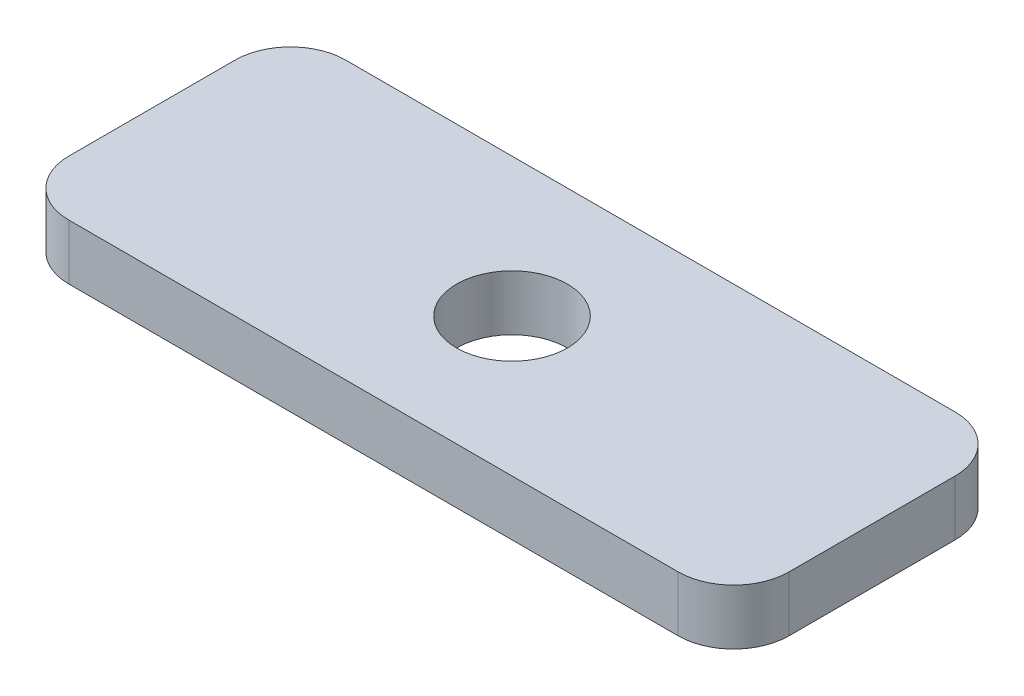
ISO-10303-21;
HEADER;
FILE_DESCRIPTION(('STEP AP214'),'2;1');
FILE_NAME('part.step','',(''),(''),'','','');
FILE_SCHEMA(('AUTOMOTIVE_DESIGN { 1 0 10303 214 1 1 1 1 }'));
ENDSEC;
DATA;
#1=APPLICATION_CONTEXT('core data for automotive mechanical design processes');
#2=APPLICATION_PROTOCOL_DEFINITION('international standard','automotive_design',2000,#1);
#3=PRODUCT_CONTEXT('',#1,'mechanical');
#4=PRODUCT('Part','Part','',(#3));
#5=PRODUCT_RELATED_PRODUCT_CATEGORY('part','',(#4));
#6=PRODUCT_DEFINITION_FORMATION('','',#4);
#7=PRODUCT_DEFINITION_CONTEXT('part definition',#1,'design');
#8=PRODUCT_DEFINITION('design','',#6,#7);
#9=PRODUCT_DEFINITION_SHAPE('','',#8);
#10=(LENGTH_UNIT() NAMED_UNIT(*) SI_UNIT(.MILLI.,.METRE.));
#11=(NAMED_UNIT(*) PLANE_ANGLE_UNIT() SI_UNIT($,.RADIAN.));
#12=(NAMED_UNIT(*) SI_UNIT($,.STERADIAN.) SOLID_ANGLE_UNIT());
#13=UNCERTAINTY_MEASURE_WITH_UNIT(LENGTH_MEASURE(1.E-05),#10,'distance_accuracy_value','');
#14=(GEOMETRIC_REPRESENTATION_CONTEXT(3) GLOBAL_UNCERTAINTY_ASSIGNED_CONTEXT((#13)) GLOBAL_UNIT_ASSIGNED_CONTEXT((#10,
#11,#12)) REPRESENTATION_CONTEXT('',''));
#15=CARTESIAN_POINT('',(0.,0.,0.));
#16=DIRECTION('',(0.,0.,1.));
#17=DIRECTION('',(1.,0.,0.));
#18=AXIS2_PLACEMENT_3D('',#15,#16,#17);
#19=CARTESIAN_POINT('',(0.,2.,-10.));
#20=DIRECTION('',(0.,-1.,0.));
#21=DIRECTION('',(0.,0.,-1.));
#22=AXIS2_PLACEMENT_3D('',#19,#20,#21);
#23=PLANE('',#22);
#24=DIRECTION('',(-1.,0.,0.));
#25=VECTOR('',#24,1.);
#26=CARTESIAN_POINT('',(0.,2.,-10.));
#27=LINE('',#26,#25);
#28=CARTESIAN_POINT('',(24.,2.,-10.));
#29=VERTEX_POINT('',#28);
#30=CARTESIAN_POINT('',(2.,2.,-10.));
#31=VERTEX_POINT('',#30);
#32=EDGE_CURVE('E137',#29,#31,#27,.T.);
#33=ORIENTED_EDGE('',*,*,#32,.T.);
#34=CARTESIAN_POINT('',(2.,2.,-8.));
#35=DIRECTION('',(0.,-1.,0.));
#36=DIRECTION('',(0.,0.,-1.));
#37=AXIS2_PLACEMENT_3D('',#34,#35,#36);
#38=CIRCLE('',#37,2.);
#39=CARTESIAN_POINT('',(0.,2.,-8.));
#40=VERTEX_POINT('',#39);
#41=EDGE_CURVE('E155',#31,#40,#38,.F.);
#42=ORIENTED_EDGE('',*,*,#41,.T.);
#43=DIRECTION('',(0.,0.,1.));
#44=VECTOR('',#43,1.);
#45=CARTESIAN_POINT('',(0.,2.,0.));
#46=LINE('',#45,#44);
#47=CARTESIAN_POINT('',(0.,2.,-2.));
#48=VERTEX_POINT('',#47);
#49=EDGE_CURVE('E119',#40,#48,#46,.T.);
#50=ORIENTED_EDGE('',*,*,#49,.T.);
#51=CARTESIAN_POINT('',(2.,2.,-2.));
#52=DIRECTION('',(0.,-1.,0.));
#53=DIRECTION('',(0.,0.,-1.));
#54=AXIS2_PLACEMENT_3D('',#51,#52,#53);
#55=CIRCLE('',#54,2.);
#56=CARTESIAN_POINT('',(2.,2.,0.));
#57=VERTEX_POINT('',#56);
#58=EDGE_CURVE('E151',#48,#57,#55,.F.);
#59=ORIENTED_EDGE('',*,*,#58,.T.);
#60=DIRECTION('',(1.,0.,0.));
#61=VECTOR('',#60,1.);
#62=CARTESIAN_POINT('',(0.,2.,0.));
#63=LINE('',#62,#61);
#64=CARTESIAN_POINT('',(24.,2.,0.));
#65=VERTEX_POINT('',#64);
#66=EDGE_CURVE('E164',#57,#65,#63,.T.);
#67=ORIENTED_EDGE('',*,*,#66,.T.);
#68=CARTESIAN_POINT('',(24.,2.,-2.));
#69=DIRECTION('',(0.,-1.,0.));
#70=DIRECTION('',(0.,0.,-1.));
#71=AXIS2_PLACEMENT_3D('',#68,#69,#70);
#72=CIRCLE('',#71,2.);
#73=CARTESIAN_POINT('',(26.,2.,-2.));
#74=VERTEX_POINT('',#73);
#75=EDGE_CURVE('E54',#65,#74,#72,.F.);
#76=ORIENTED_EDGE('',*,*,#75,.T.);
#77=DIRECTION('',(0.,0.,-1.));
#78=VECTOR('',#77,1.);
#79=CARTESIAN_POINT('',(26.,2.,0.));
#80=LINE('',#79,#78);
#81=CARTESIAN_POINT('',(26.,2.,-8.));
#82=VERTEX_POINT('',#81);
#83=EDGE_CURVE('E170',#74,#82,#80,.T.);
#84=ORIENTED_EDGE('',*,*,#83,.T.);
#85=CARTESIAN_POINT('',(24.,2.,-8.));
#86=DIRECTION('',(0.,-1.,0.));
#87=DIRECTION('',(0.,0.,-1.));
#88=AXIS2_PLACEMENT_3D('',#85,#86,#87);
#89=CIRCLE('',#88,2.);
#90=EDGE_CURVE('E153',#82,#29,#89,.F.);
#91=ORIENTED_EDGE('',*,*,#90,.T.);
#92=EDGE_LOOP('',(#33,#42,#50,#59,#67,#76,#84,#91));
#93=FACE_BOUND('',#92,.T.);
#94=CARTESIAN_POINT('',(13.,2.,-5.));
#95=DIRECTION('',(0.,1.,0.));
#96=DIRECTION('',(0.,0.,1.));
#97=AXIS2_PLACEMENT_3D('',#94,#95,#96);
#98=CIRCLE('',#97,2.);
#99=CARTESIAN_POINT('',(13.,2.,-3.));
#100=VERTEX_POINT('',#99);
#101=EDGE_CURVE('E128',#100,#100,#98,.T.);
#102=ORIENTED_EDGE('',*,*,#101,.F.);
#103=EDGE_LOOP('',(#102));
#104=FACE_BOUND('',#103,.T.);
#105=ADVANCED_FACE('F32',(#93,#104),#23,.F.);
#106=CARTESIAN_POINT('',(0.,0.,-10.));
#107=DIRECTION('',(0.,-1.,0.));
#108=DIRECTION('',(0.,0.,-1.));
#109=AXIS2_PLACEMENT_3D('',#106,#107,#108);
#110=PLANE('',#109);
#111=DIRECTION('',(0.,0.,1.));
#112=VECTOR('',#111,1.);
#113=CARTESIAN_POINT('',(0.,0.,0.));
#114=LINE('',#113,#112);
#115=CARTESIAN_POINT('',(0.,0.,-8.));
#116=VERTEX_POINT('',#115);
#117=CARTESIAN_POINT('',(0.,0.,-2.));
#118=VERTEX_POINT('',#117);
#119=EDGE_CURVE('E116',#116,#118,#114,.T.);
#120=ORIENTED_EDGE('',*,*,#119,.F.);
#121=CARTESIAN_POINT('',(2.,0.,-8.));
#122=DIRECTION('',(0.,-1.,0.));
#123=DIRECTION('',(0.,0.,-1.));
#124=AXIS2_PLACEMENT_3D('',#121,#122,#123);
#125=CIRCLE('',#124,2.);
#126=CARTESIAN_POINT('',(2.,0.,-10.));
#127=VERTEX_POINT('',#126);
#128=EDGE_CURVE('E99',#116,#127,#125,.T.);
#129=ORIENTED_EDGE('',*,*,#128,.T.);
#130=DIRECTION('',(-1.,0.,0.));
#131=VECTOR('',#130,1.);
#132=CARTESIAN_POINT('',(0.,0.,-10.));
#133=LINE('',#132,#131);
#134=CARTESIAN_POINT('',(24.,0.,-10.));
#135=VERTEX_POINT('',#134);
#136=EDGE_CURVE('E141',#135,#127,#133,.T.);
#137=ORIENTED_EDGE('',*,*,#136,.F.);
#138=CARTESIAN_POINT('',(24.,0.,-8.));
#139=DIRECTION('',(0.,-1.,0.));
#140=DIRECTION('',(0.,0.,-1.));
#141=AXIS2_PLACEMENT_3D('',#138,#139,#140);
#142=CIRCLE('',#141,2.);
#143=CARTESIAN_POINT('',(26.,0.,-8.));
#144=VERTEX_POINT('',#143);
#145=EDGE_CURVE('E110',#135,#144,#142,.T.);
#146=ORIENTED_EDGE('',*,*,#145,.T.);
#147=DIRECTION('',(0.,0.,-1.));
#148=VECTOR('',#147,1.);
#149=CARTESIAN_POINT('',(26.,0.,0.));
#150=LINE('',#149,#148);
#151=CARTESIAN_POINT('',(26.,0.,-2.));
#152=VERTEX_POINT('',#151);
#153=EDGE_CURVE('E131',#152,#144,#150,.T.);
#154=ORIENTED_EDGE('',*,*,#153,.F.);
#155=CARTESIAN_POINT('',(24.,0.,-2.));
#156=DIRECTION('',(0.,-1.,0.));
#157=DIRECTION('',(0.,0.,-1.));
#158=AXIS2_PLACEMENT_3D('',#155,#156,#157);
#159=CIRCLE('',#158,2.);
#160=CARTESIAN_POINT('',(24.,0.,0.));
#161=VERTEX_POINT('',#160);
#162=EDGE_CURVE('E120',#152,#161,#159,.T.);
#163=ORIENTED_EDGE('',*,*,#162,.T.);
#164=DIRECTION('',(1.,0.,0.));
#165=VECTOR('',#164,1.);
#166=CARTESIAN_POINT('',(0.,0.,0.));
#167=LINE('',#166,#165);
#168=CARTESIAN_POINT('',(2.,0.,0.));
#169=VERTEX_POINT('',#168);
#170=EDGE_CURVE('E127',#169,#161,#167,.T.);
#171=ORIENTED_EDGE('',*,*,#170,.F.);
#172=CARTESIAN_POINT('',(2.,0.,-2.));
#173=DIRECTION('',(0.,-1.,0.));
#174=DIRECTION('',(0.,0.,-1.));
#175=AXIS2_PLACEMENT_3D('',#172,#173,#174);
#176=CIRCLE('',#175,2.);
#177=EDGE_CURVE('E126',#169,#118,#176,.T.);
#178=ORIENTED_EDGE('',*,*,#177,.T.);
#179=EDGE_LOOP('',(#120,#129,#137,#146,#154,#163,#171,#178));
#180=FACE_BOUND('',#179,.T.);
#181=CARTESIAN_POINT('',(13.,0.,-5.));
#182=DIRECTION('',(0.,1.,0.));
#183=DIRECTION('',(0.,0.,1.));
#184=AXIS2_PLACEMENT_3D('',#181,#182,#183);
#185=CIRCLE('',#184,2.);
#186=CARTESIAN_POINT('',(13.,0.,-3.));
#187=VERTEX_POINT('',#186);
#188=EDGE_CURVE('E134',#187,#187,#185,.T.);
#189=ORIENTED_EDGE('',*,*,#188,.T.);
#190=EDGE_LOOP('',(#189));
#191=FACE_BOUND('',#190,.T.);
#192=ADVANCED_FACE('F123',(#180,#191),#110,.T.);
#193=CARTESIAN_POINT('',(0.,2.,0.));
#194=DIRECTION('',(1.,0.,0.));
#195=DIRECTION('',(0.,0.,-1.));
#196=AXIS2_PLACEMENT_3D('',#193,#194,#195);
#197=PLANE('',#196);
#198=ORIENTED_EDGE('',*,*,#49,.F.);
#199=DIRECTION('',(0.,-1.,0.));
#200=VECTOR('',#199,1.);
#201=CARTESIAN_POINT('',(0.,2.,-8.));
#202=LINE('',#201,#200);
#203=EDGE_CURVE('E103',#40,#116,#202,.T.);
#204=ORIENTED_EDGE('',*,*,#203,.T.);
#205=ORIENTED_EDGE('',*,*,#119,.T.);
#206=DIRECTION('',(0.,-1.,0.));
#207=VECTOR('',#206,1.);
#208=CARTESIAN_POINT('',(0.,2.,-2.));
#209=LINE('',#208,#207);
#210=EDGE_CURVE('E121',#118,#48,#209,.F.);
#211=ORIENTED_EDGE('',*,*,#210,.T.);
#212=EDGE_LOOP('',(#198,#204,#205,#211));
#213=FACE_BOUND('',#212,.T.);
#214=ADVANCED_FACE('F115',(#213),#197,.F.);
#215=CARTESIAN_POINT('',(0.,2.,0.));
#216=DIRECTION('',(0.,0.,-1.));
#217=DIRECTION('',(-1.,0.,0.));
#218=AXIS2_PLACEMENT_3D('',#215,#216,#217);
#219=PLANE('',#218);
#220=ORIENTED_EDGE('',*,*,#66,.F.);
#221=DIRECTION('',(0.,-1.,0.));
#222=VECTOR('',#221,1.);
#223=CARTESIAN_POINT('',(2.,2.,0.));
#224=LINE('',#223,#222);
#225=EDGE_CURVE('E11',#57,#169,#224,.T.);
#226=ORIENTED_EDGE('',*,*,#225,.T.);
#227=ORIENTED_EDGE('',*,*,#170,.T.);
#228=DIRECTION('',(0.,-1.,0.));
#229=VECTOR('',#228,1.);
#230=CARTESIAN_POINT('',(24.,2.,0.));
#231=LINE('',#230,#229);
#232=EDGE_CURVE('E40',#161,#65,#231,.F.);
#233=ORIENTED_EDGE('',*,*,#232,.T.);
#234=EDGE_LOOP('',(#220,#226,#227,#233));
#235=FACE_BOUND('',#234,.T.);
#236=ADVANCED_FACE('F163',(#235),#219,.F.);
#237=CARTESIAN_POINT('',(26.,2.,0.));
#238=DIRECTION('',(-1.,0.,0.));
#239=DIRECTION('',(0.,0.,1.));
#240=AXIS2_PLACEMENT_3D('',#237,#238,#239);
#241=PLANE('',#240);
#242=ORIENTED_EDGE('',*,*,#153,.T.);
#243=DIRECTION('',(0.,-1.,0.));
#244=VECTOR('',#243,1.);
#245=CARTESIAN_POINT('',(26.,2.,-8.));
#246=LINE('',#245,#244);
#247=EDGE_CURVE('E47',#144,#82,#246,.F.);
#248=ORIENTED_EDGE('',*,*,#247,.T.);
#249=ORIENTED_EDGE('',*,*,#83,.F.);
#250=DIRECTION('',(0.,-1.,0.));
#251=VECTOR('',#250,1.);
#252=CARTESIAN_POINT('',(26.,2.,-2.));
#253=LINE('',#252,#251);
#254=EDGE_CURVE('E157',#74,#152,#253,.T.);
#255=ORIENTED_EDGE('',*,*,#254,.T.);
#256=EDGE_LOOP('',(#242,#248,#249,#255));
#257=FACE_BOUND('',#256,.T.);
#258=ADVANCED_FACE('F174',(#257),#241,.F.);
#259=CARTESIAN_POINT('',(0.,2.,-10.));
#260=DIRECTION('',(0.,0.,1.));
#261=DIRECTION('',(1.,0.,0.));
#262=AXIS2_PLACEMENT_3D('',#259,#260,#261);
#263=PLANE('',#262);
#264=ORIENTED_EDGE('',*,*,#136,.T.);
#265=DIRECTION('',(0.,-1.,0.));
#266=VECTOR('',#265,1.);
#267=CARTESIAN_POINT('',(2.,2.,-10.));
#268=LINE('',#267,#266);
#269=EDGE_CURVE('E104',#127,#31,#268,.F.);
#270=ORIENTED_EDGE('',*,*,#269,.T.);
#271=ORIENTED_EDGE('',*,*,#32,.F.);
#272=DIRECTION('',(0.,-1.,0.));
#273=VECTOR('',#272,1.);
#274=CARTESIAN_POINT('',(24.,2.,-10.));
#275=LINE('',#274,#273);
#276=EDGE_CURVE('E109',#29,#135,#275,.T.);
#277=ORIENTED_EDGE('',*,*,#276,.T.);
#278=EDGE_LOOP('',(#264,#270,#271,#277));
#279=FACE_BOUND('',#278,.T.);
#280=ADVANCED_FACE('F181',(#279),#263,.F.);
#281=CARTESIAN_POINT('',(13.,2.,-5.));
#282=DIRECTION('',(0.,-1.,0.));
#283=DIRECTION('',(0.,0.,-1.));
#284=AXIS2_PLACEMENT_3D('',#281,#282,#283);
#285=CYLINDRICAL_SURFACE('',#284,2.);
#286=ORIENTED_EDGE('',*,*,#101,.T.);
#287=EDGE_LOOP('',(#286));
#288=FACE_BOUND('',#287,.T.);
#289=ORIENTED_EDGE('',*,*,#188,.F.);
#290=EDGE_LOOP('',(#289));
#291=FACE_BOUND('',#290,.T.);
#292=ADVANCED_FACE('F187',(#288,#291),#285,.F.);
#293=CARTESIAN_POINT('',(2.,2.,-8.));
#294=DIRECTION('',(0.,-1.,0.));
#295=DIRECTION('',(0.,0.,-1.));
#296=AXIS2_PLACEMENT_3D('',#293,#294,#295);
#297=CYLINDRICAL_SURFACE('',#296,2.);
#298=ORIENTED_EDGE('',*,*,#41,.F.);
#299=ORIENTED_EDGE('',*,*,#269,.F.);
#300=ORIENTED_EDGE('',*,*,#128,.F.);
#301=ORIENTED_EDGE('',*,*,#203,.F.);
#302=EDGE_LOOP('',(#298,#299,#300,#301));
#303=FACE_BOUND('',#302,.T.);
#304=ADVANCED_FACE('F102',(#303),#297,.T.);
#305=CARTESIAN_POINT('',(24.,2.,-8.));
#306=DIRECTION('',(0.,-1.,0.));
#307=DIRECTION('',(0.,0.,-1.));
#308=AXIS2_PLACEMENT_3D('',#305,#306,#307);
#309=CYLINDRICAL_SURFACE('',#308,2.);
#310=ORIENTED_EDGE('',*,*,#90,.F.);
#311=ORIENTED_EDGE('',*,*,#247,.F.);
#312=ORIENTED_EDGE('',*,*,#145,.F.);
#313=ORIENTED_EDGE('',*,*,#276,.F.);
#314=EDGE_LOOP('',(#310,#311,#312,#313));
#315=FACE_BOUND('',#314,.T.);
#316=ADVANCED_FACE('F178',(#315),#309,.T.);
#317=CARTESIAN_POINT('',(2.,2.,-2.));
#318=DIRECTION('',(0.,-1.,0.));
#319=DIRECTION('',(0.,0.,-1.));
#320=AXIS2_PLACEMENT_3D('',#317,#318,#319);
#321=CYLINDRICAL_SURFACE('',#320,2.);
#322=ORIENTED_EDGE('',*,*,#58,.F.);
#323=ORIENTED_EDGE('',*,*,#210,.F.);
#324=ORIENTED_EDGE('',*,*,#177,.F.);
#325=ORIENTED_EDGE('',*,*,#225,.F.);
#326=EDGE_LOOP('',(#322,#323,#324,#325));
#327=FACE_BOUND('',#326,.T.);
#328=ADVANCED_FACE('F211',(#327),#321,.T.);
#329=CARTESIAN_POINT('',(24.,2.,-2.));
#330=DIRECTION('',(0.,-1.,0.));
#331=DIRECTION('',(0.,0.,-1.));
#332=AXIS2_PLACEMENT_3D('',#329,#330,#331);
#333=CYLINDRICAL_SURFACE('',#332,2.);
#334=ORIENTED_EDGE('',*,*,#75,.F.);
#335=ORIENTED_EDGE('',*,*,#232,.F.);
#336=ORIENTED_EDGE('',*,*,#162,.F.);
#337=ORIENTED_EDGE('',*,*,#254,.F.);
#338=EDGE_LOOP('',(#334,#335,#336,#337));
#339=FACE_BOUND('',#338,.T.);
#340=ADVANCED_FACE('F34',(#339),#333,.T.);
#341=CLOSED_SHELL('',(#105,#192,#214,#236,#258,#280,#292,#304,#316,#328,#340));
#342=MANIFOLD_SOLID_BREP('B2',#341);
#343=ADVANCED_BREP_SHAPE_REPRESENTATION('',(#18,#342),#14);
#344=SHAPE_DEFINITION_REPRESENTATION(#9,#343);
ENDSEC;
END-ISO-10303-21;
